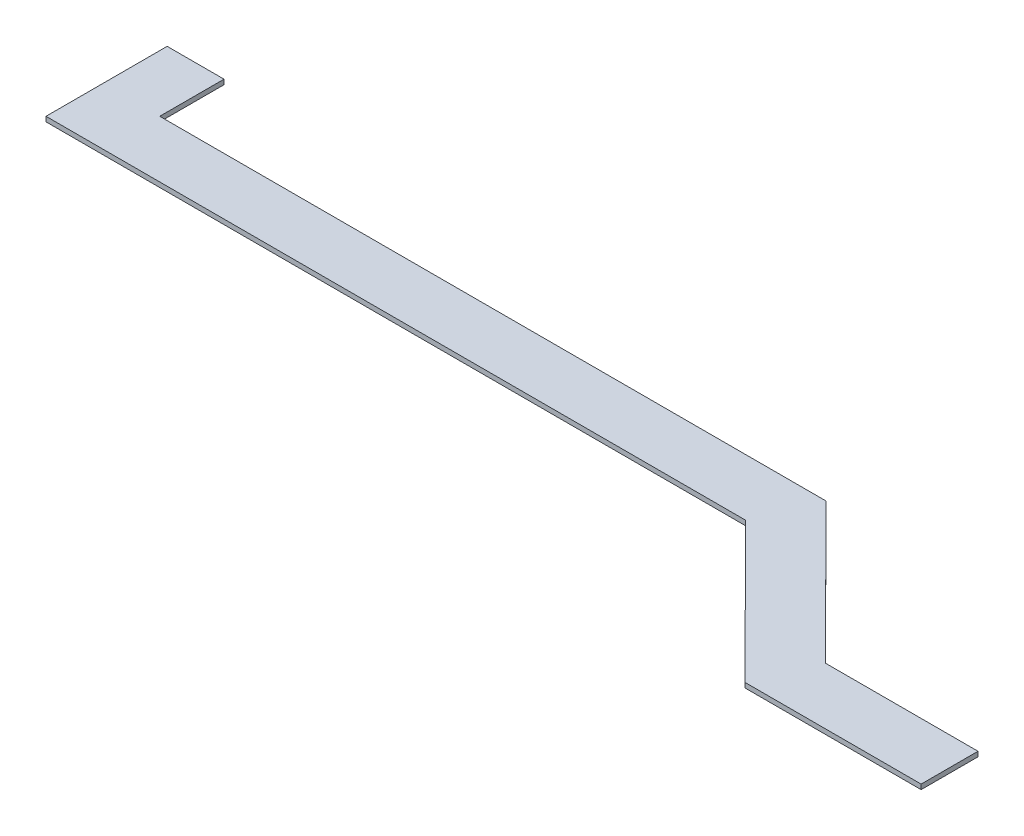
ISO-10303-21;
HEADER;
FILE_DESCRIPTION(('STEP AP214'),'2;1');
FILE_NAME('part.step','',(''),(''),'','','');
FILE_SCHEMA(('AUTOMOTIVE_DESIGN { 1 0 10303 214 1 1 1 1 }'));
ENDSEC;
DATA;
#1=APPLICATION_CONTEXT('core data for automotive mechanical design processes');
#2=APPLICATION_PROTOCOL_DEFINITION('international standard','automotive_design',2000,#1);
#3=PRODUCT_CONTEXT('',#1,'mechanical');
#4=PRODUCT('Part','Part','',(#3));
#5=PRODUCT_RELATED_PRODUCT_CATEGORY('part','',(#4));
#6=PRODUCT_DEFINITION_FORMATION('','',#4);
#7=PRODUCT_DEFINITION_CONTEXT('part definition',#1,'design');
#8=PRODUCT_DEFINITION('design','',#6,#7);
#9=PRODUCT_DEFINITION_SHAPE('','',#8);
#10=(LENGTH_UNIT() NAMED_UNIT(*) SI_UNIT(.MILLI.,.METRE.));
#11=(NAMED_UNIT(*) PLANE_ANGLE_UNIT() SI_UNIT($,.RADIAN.));
#12=(NAMED_UNIT(*) SI_UNIT($,.STERADIAN.) SOLID_ANGLE_UNIT());
#13=UNCERTAINTY_MEASURE_WITH_UNIT(LENGTH_MEASURE(1.E-05),#10,'distance_accuracy_value','');
#14=(GEOMETRIC_REPRESENTATION_CONTEXT(3) GLOBAL_UNCERTAINTY_ASSIGNED_CONTEXT((#13)) GLOBAL_UNIT_ASSIGNED_CONTEXT((#10,
#11,#12)) REPRESENTATION_CONTEXT('',''));
#15=CARTESIAN_POINT('',(0.,0.,0.));
#16=DIRECTION('',(0.,0.,1.));
#17=DIRECTION('',(1.,0.,0.));
#18=AXIS2_PLACEMENT_3D('',#15,#16,#17);
#19=CARTESIAN_POINT('',(0.,0.3,0.));
#20=DIRECTION('',(0.,0.,1.));
#21=DIRECTION('',(1.,0.,0.));
#22=AXIS2_PLACEMENT_3D('',#19,#20,#21);
#23=PLANE('',#22);
#24=DIRECTION('',(-1.,0.,0.));
#25=VECTOR('',#24,1.);
#26=CARTESIAN_POINT('',(0.,0.,0.));
#27=LINE('',#26,#25);
#28=CARTESIAN_POINT('',(3.52,0.,0.));
#29=VERTEX_POINT('',#28);
#30=CARTESIAN_POINT('',(0.,0.,0.));
#31=VERTEX_POINT('',#30);
#32=EDGE_CURVE('E145',#29,#31,#27,.T.);
#33=ORIENTED_EDGE('',*,*,#32,.T.);
#34=DIRECTION('',(0.,-1.,0.));
#35=VECTOR('',#34,1.);
#36=CARTESIAN_POINT('',(0.,0.3,0.));
#37=LINE('',#36,#35);
#38=CARTESIAN_POINT('',(0.,0.3,0.));
#39=VERTEX_POINT('',#38);
#40=EDGE_CURVE('E11',#39,#31,#37,.T.);
#41=ORIENTED_EDGE('',*,*,#40,.F.);
#42=DIRECTION('',(-1.,0.,0.));
#43=VECTOR('',#42,1.);
#44=CARTESIAN_POINT('',(0.,0.3,0.));
#45=LINE('',#44,#43);
#46=CARTESIAN_POINT('',(3.52,0.3,0.));
#47=VERTEX_POINT('',#46);
#48=EDGE_CURVE('E163',#47,#39,#45,.T.);
#49=ORIENTED_EDGE('',*,*,#48,.F.);
#50=DIRECTION('',(0.,-1.,0.));
#51=VECTOR('',#50,1.);
#52=CARTESIAN_POINT('',(3.52,0.3,0.));
#53=LINE('',#52,#51);
#54=EDGE_CURVE('E141',#47,#29,#53,.T.);
#55=ORIENTED_EDGE('',*,*,#54,.T.);
#56=EDGE_LOOP('',(#33,#41,#49,#55));
#57=FACE_BOUND('',#56,.T.);
#58=ADVANCED_FACE('F37',(#57),#23,.F.);
#59=CARTESIAN_POINT('',(0.,0.3,0.));
#60=DIRECTION('',(1.,0.,0.));
#61=DIRECTION('',(0.,0.,-1.));
#62=AXIS2_PLACEMENT_3D('',#59,#60,#61);
#63=PLANE('',#62);
#64=DIRECTION('',(0.,0.,1.));
#65=VECTOR('',#64,1.);
#66=CARTESIAN_POINT('',(0.,0.,0.));
#67=LINE('',#66,#65);
#68=CARTESIAN_POINT('',(0.,0.,7.5));
#69=VERTEX_POINT('',#68);
#70=EDGE_CURVE('E148',#31,#69,#67,.T.);
#71=ORIENTED_EDGE('',*,*,#70,.T.);
#72=DIRECTION('',(0.,-1.,0.));
#73=VECTOR('',#72,1.);
#74=CARTESIAN_POINT('',(0.,0.3,7.5));
#75=LINE('',#74,#73);
#76=CARTESIAN_POINT('',(0.,0.3,7.5));
#77=VERTEX_POINT('',#76);
#78=EDGE_CURVE('E45',#77,#69,#75,.T.);
#79=ORIENTED_EDGE('',*,*,#78,.F.);
#80=DIRECTION('',(0.,0.,1.));
#81=VECTOR('',#80,1.);
#82=CARTESIAN_POINT('',(0.,0.3,0.));
#83=LINE('',#82,#81);
#84=EDGE_CURVE('E102',#39,#77,#83,.T.);
#85=ORIENTED_EDGE('',*,*,#84,.F.);
#86=ORIENTED_EDGE('',*,*,#40,.T.);
#87=EDGE_LOOP('',(#71,#79,#85,#86));
#88=FACE_BOUND('',#87,.T.);
#89=ADVANCED_FACE('F212',(#88),#63,.F.);
#90=CARTESIAN_POINT('',(0.,0.3,7.5));
#91=DIRECTION('',(0.,0.,-1.));
#92=DIRECTION('',(-1.,0.,0.));
#93=AXIS2_PLACEMENT_3D('',#90,#91,#92);
#94=PLANE('',#93);
#95=DIRECTION('',(1.,0.,0.));
#96=VECTOR('',#95,1.);
#97=CARTESIAN_POINT('',(0.,0.,7.5));
#98=LINE('',#97,#96);
#99=CARTESIAN_POINT('',(43.3004,0.,7.5));
#100=VERTEX_POINT('',#99);
#101=EDGE_CURVE('E150',#69,#100,#98,.T.);
#102=ORIENTED_EDGE('',*,*,#101,.T.);
#103=DIRECTION('',(0.,-1.,0.));
#104=VECTOR('',#103,1.);
#105=CARTESIAN_POINT('',(43.3004,0.3,7.5));
#106=LINE('',#105,#104);
#107=CARTESIAN_POINT('',(43.3004,0.3,7.5));
#108=VERTEX_POINT('',#107);
#109=EDGE_CURVE('E176',#108,#100,#106,.T.);
#110=ORIENTED_EDGE('',*,*,#109,.F.);
#111=DIRECTION('',(1.,0.,0.));
#112=VECTOR('',#111,1.);
#113=CARTESIAN_POINT('',(0.,0.3,7.5));
#114=LINE('',#113,#112);
#115=EDGE_CURVE('E184',#77,#108,#114,.T.);
#116=ORIENTED_EDGE('',*,*,#115,.F.);
#117=ORIENTED_EDGE('',*,*,#78,.T.);
#118=EDGE_LOOP('',(#102,#110,#116,#117));
#119=FACE_BOUND('',#118,.T.);
#120=ADVANCED_FACE('F182',(#119),#94,.F.);
#121=CARTESIAN_POINT('',(43.3004,0.3,7.5));
#122=DIRECTION('',(0.708212821190194,0.,-0.705999008428359));
#123=DIRECTION('',(-0.705999008428359,0.,-0.708212821190194));
#124=AXIS2_PLACEMENT_3D('',#121,#122,#123);
#125=PLANE('',#124);
#126=DIRECTION('',(0.705999008428359,0.,0.708212821190194));
#127=VECTOR('',#126,1.);
#128=CARTESIAN_POINT('',(43.3004,0.,7.5));
#129=LINE('',#128,#127);
#130=CARTESIAN_POINT('',(51.9868,0.,16.2136380880778));
#131=VERTEX_POINT('',#130);
#132=EDGE_CURVE('E152',#100,#131,#129,.T.);
#133=ORIENTED_EDGE('',*,*,#132,.T.);
#134=DIRECTION('',(0.,-1.,0.));
#135=VECTOR('',#134,1.);
#136=CARTESIAN_POINT('',(51.9868,0.3,16.2136380880778));
#137=LINE('',#136,#135);
#138=CARTESIAN_POINT('',(51.9868,0.3,16.2136380880778));
#139=VERTEX_POINT('',#138);
#140=EDGE_CURVE('E173',#139,#131,#137,.T.);
#141=ORIENTED_EDGE('',*,*,#140,.F.);
#142=DIRECTION('',(0.705999008428359,0.,0.708212821190194));
#143=VECTOR('',#142,1.);
#144=CARTESIAN_POINT('',(43.3004,0.3,7.5));
#145=LINE('',#144,#143);
#146=EDGE_CURVE('E202',#108,#139,#145,.T.);
#147=ORIENTED_EDGE('',*,*,#146,.F.);
#148=ORIENTED_EDGE('',*,*,#109,.T.);
#149=EDGE_LOOP('',(#133,#141,#147,#148));
#150=FACE_BOUND('',#149,.T.);
#151=ADVANCED_FACE('F193',(#150),#125,.F.);
#152=CARTESIAN_POINT('',(51.9868,0.3,16.2136380880778));
#153=DIRECTION('',(0.,0.,-1.));
#154=DIRECTION('',(-1.,0.,0.));
#155=AXIS2_PLACEMENT_3D('',#152,#153,#154);
#156=PLANE('',#155);
#157=DIRECTION('',(1.,0.,0.));
#158=VECTOR('',#157,1.);
#159=CARTESIAN_POINT('',(51.9868,0.,16.2136380880778));
#160=LINE('',#159,#158);
#161=CARTESIAN_POINT('',(62.8868,0.,16.2136380880778));
#162=VERTEX_POINT('',#161);
#163=EDGE_CURVE('E154',#131,#162,#160,.T.);
#164=ORIENTED_EDGE('',*,*,#163,.T.);
#165=DIRECTION('',(0.,-1.,0.));
#166=VECTOR('',#165,1.);
#167=CARTESIAN_POINT('',(62.8868,0.3,16.2136380880778));
#168=LINE('',#167,#166);
#169=CARTESIAN_POINT('',(62.8868,0.3,16.2136380880778));
#170=VERTEX_POINT('',#169);
#171=EDGE_CURVE('E170',#170,#162,#168,.T.);
#172=ORIENTED_EDGE('',*,*,#171,.F.);
#173=DIRECTION('',(1.,0.,0.));
#174=VECTOR('',#173,1.);
#175=CARTESIAN_POINT('',(51.9868,0.3,16.2136380880778));
#176=LINE('',#175,#174);
#177=EDGE_CURVE('E199',#139,#170,#176,.T.);
#178=ORIENTED_EDGE('',*,*,#177,.F.);
#179=ORIENTED_EDGE('',*,*,#140,.T.);
#180=EDGE_LOOP('',(#164,#172,#178,#179));
#181=FACE_BOUND('',#180,.T.);
#182=ADVANCED_FACE('F197',(#181),#156,.F.);
#183=CARTESIAN_POINT('',(62.8868000000001,0.3,12.6936380880778));
#184=DIRECTION('',(-1.,0.,0.));
#185=DIRECTION('',(0.,0.,1.));
#186=AXIS2_PLACEMENT_3D('',#183,#184,#185);
#187=PLANE('',#186);
#188=DIRECTION('',(0.,0.,-1.));
#189=VECTOR('',#188,1.);
#190=CARTESIAN_POINT('',(62.8868000000001,0.,12.6936380880778));
#191=LINE('',#190,#189);
#192=CARTESIAN_POINT('',(62.8868000000001,0.,12.6936380880778));
#193=VERTEX_POINT('',#192);
#194=EDGE_CURVE('E156',#162,#193,#191,.T.);
#195=ORIENTED_EDGE('',*,*,#194,.T.);
#196=DIRECTION('',(0.,-1.,0.));
#197=VECTOR('',#196,1.);
#198=CARTESIAN_POINT('',(62.8868000000001,0.3,12.6936380880778));
#199=LINE('',#198,#197);
#200=CARTESIAN_POINT('',(62.8868000000001,0.3,12.6936380880778));
#201=VERTEX_POINT('',#200);
#202=EDGE_CURVE('E167',#201,#193,#199,.T.);
#203=ORIENTED_EDGE('',*,*,#202,.F.);
#204=DIRECTION('',(0.,0.,-1.));
#205=VECTOR('',#204,1.);
#206=CARTESIAN_POINT('',(62.8868000000001,0.3,12.6936380880778));
#207=LINE('',#206,#205);
#208=EDGE_CURVE('E201',#170,#201,#207,.T.);
#209=ORIENTED_EDGE('',*,*,#208,.F.);
#210=ORIENTED_EDGE('',*,*,#171,.T.);
#211=EDGE_LOOP('',(#195,#203,#209,#210));
#212=FACE_BOUND('',#211,.T.);
#213=ADVANCED_FACE('F224',(#212),#187,.F.);
#214=CARTESIAN_POINT('',(53.4480605976167,0.3,12.6936380880778));
#215=DIRECTION('',(0.,0.,1.));
#216=DIRECTION('',(1.,0.,0.));
#217=AXIS2_PLACEMENT_3D('',#214,#215,#216);
#218=PLANE('',#217);
#219=DIRECTION('',(-1.,0.,0.));
#220=VECTOR('',#219,1.);
#221=CARTESIAN_POINT('',(53.4480605976167,0.,12.6936380880778));
#222=LINE('',#221,#220);
#223=CARTESIAN_POINT('',(53.4480605976167,0.,12.6936380880778));
#224=VERTEX_POINT('',#223);
#225=EDGE_CURVE('E158',#193,#224,#222,.T.);
#226=ORIENTED_EDGE('',*,*,#225,.T.);
#227=DIRECTION('',(0.,-1.,0.));
#228=VECTOR('',#227,1.);
#229=CARTESIAN_POINT('',(53.4480605976167,0.3,12.6936380880778));
#230=LINE('',#229,#228);
#231=CARTESIAN_POINT('',(53.4480605976167,0.3,12.6936380880778));
#232=VERTEX_POINT('',#231);
#233=EDGE_CURVE('E136',#232,#224,#230,.T.);
#234=ORIENTED_EDGE('',*,*,#233,.F.);
#235=DIRECTION('',(-1.,0.,0.));
#236=VECTOR('',#235,1.);
#237=CARTESIAN_POINT('',(53.4480605976167,0.3,12.6936380880778));
#238=LINE('',#237,#236);
#239=EDGE_CURVE('E127',#201,#232,#238,.T.);
#240=ORIENTED_EDGE('',*,*,#239,.F.);
#241=ORIENTED_EDGE('',*,*,#202,.T.);
#242=EDGE_LOOP('',(#226,#234,#240,#241));
#243=FACE_BOUND('',#242,.T.);
#244=ADVANCED_FACE('F227',(#243),#218,.F.);
#245=CARTESIAN_POINT('',(44.7616605976167,0.3,3.98));
#246=DIRECTION('',(-0.708212821190194,0.,0.705999008428359));
#247=DIRECTION('',(0.705999008428359,0.,0.708212821190194));
#248=AXIS2_PLACEMENT_3D('',#245,#246,#247);
#249=PLANE('',#248);
#250=DIRECTION('',(-0.705999008428359,0.,-0.708212821190194));
#251=VECTOR('',#250,1.);
#252=CARTESIAN_POINT('',(44.7616605976167,0.,3.98));
#253=LINE('',#252,#251);
#254=CARTESIAN_POINT('',(44.7616605976167,0.,3.98));
#255=VERTEX_POINT('',#254);
#256=EDGE_CURVE('E135',#224,#255,#253,.T.);
#257=ORIENTED_EDGE('',*,*,#256,.T.);
#258=DIRECTION('',(0.,-1.,0.));
#259=VECTOR('',#258,1.);
#260=CARTESIAN_POINT('',(44.7616605976167,0.3,3.98));
#261=LINE('',#260,#259);
#262=CARTESIAN_POINT('',(44.7616605976167,0.3,3.98));
#263=VERTEX_POINT('',#262);
#264=EDGE_CURVE('E132',#263,#255,#261,.T.);
#265=ORIENTED_EDGE('',*,*,#264,.F.);
#266=DIRECTION('',(-0.705999008428359,0.,-0.708212821190194));
#267=VECTOR('',#266,1.);
#268=CARTESIAN_POINT('',(44.7616605976167,0.3,3.98));
#269=LINE('',#268,#267);
#270=EDGE_CURVE('E121',#232,#263,#269,.T.);
#271=ORIENTED_EDGE('',*,*,#270,.F.);
#272=ORIENTED_EDGE('',*,*,#233,.T.);
#273=EDGE_LOOP('',(#257,#265,#271,#272));
#274=FACE_BOUND('',#273,.T.);
#275=ADVANCED_FACE('F133',(#274),#249,.F.);
#276=CARTESIAN_POINT('',(3.52,0.3,3.98));
#277=DIRECTION('',(0.,0.,1.));
#278=DIRECTION('',(1.,0.,0.));
#279=AXIS2_PLACEMENT_3D('',#276,#277,#278);
#280=PLANE('',#279);
#281=DIRECTION('',(-1.,0.,0.));
#282=VECTOR('',#281,1.);
#283=CARTESIAN_POINT('',(3.52,0.,3.98));
#284=LINE('',#283,#282);
#285=CARTESIAN_POINT('',(3.52,0.,3.98));
#286=VERTEX_POINT('',#285);
#287=EDGE_CURVE('E88',#255,#286,#284,.T.);
#288=ORIENTED_EDGE('',*,*,#287,.T.);
#289=DIRECTION('',(0.,-1.,0.));
#290=VECTOR('',#289,1.);
#291=CARTESIAN_POINT('',(3.52,0.3,3.98));
#292=LINE('',#291,#290);
#293=CARTESIAN_POINT('',(3.52,0.3,3.98));
#294=VERTEX_POINT('',#293);
#295=EDGE_CURVE('E137',#294,#286,#292,.T.);
#296=ORIENTED_EDGE('',*,*,#295,.F.);
#297=DIRECTION('',(-1.,0.,0.));
#298=VECTOR('',#297,1.);
#299=CARTESIAN_POINT('',(3.52,0.3,3.98));
#300=LINE('',#299,#298);
#301=EDGE_CURVE('E125',#263,#294,#300,.T.);
#302=ORIENTED_EDGE('',*,*,#301,.F.);
#303=ORIENTED_EDGE('',*,*,#264,.T.);
#304=EDGE_LOOP('',(#288,#296,#302,#303));
#305=FACE_BOUND('',#304,.T.);
#306=ADVANCED_FACE('F139',(#305),#280,.F.);
#307=CARTESIAN_POINT('',(3.52,0.3,0.));
#308=DIRECTION('',(-1.,0.,0.));
#309=DIRECTION('',(0.,0.,1.));
#310=AXIS2_PLACEMENT_3D('',#307,#308,#309);
#311=PLANE('',#310);
#312=DIRECTION('',(0.,0.,-1.));
#313=VECTOR('',#312,1.);
#314=CARTESIAN_POINT('',(3.52,0.,0.));
#315=LINE('',#314,#313);
#316=EDGE_CURVE('E94',#286,#29,#315,.T.);
#317=ORIENTED_EDGE('',*,*,#316,.T.);
#318=ORIENTED_EDGE('',*,*,#54,.F.);
#319=DIRECTION('',(0.,0.,-1.));
#320=VECTOR('',#319,1.);
#321=CARTESIAN_POINT('',(3.52,0.3,0.));
#322=LINE('',#321,#320);
#323=EDGE_CURVE('E53',#294,#47,#322,.T.);
#324=ORIENTED_EDGE('',*,*,#323,.F.);
#325=ORIENTED_EDGE('',*,*,#295,.T.);
#326=EDGE_LOOP('',(#317,#318,#324,#325));
#327=FACE_BOUND('',#326,.T.);
#328=ADVANCED_FACE('F236',(#327),#311,.F.);
#329=CARTESIAN_POINT('',(0.,0.3,0.));
#330=DIRECTION('',(0.,-1.,0.));
#331=DIRECTION('',(0.,0.,-1.));
#332=AXIS2_PLACEMENT_3D('',#329,#330,#331);
#333=PLANE('',#332);
#334=ORIENTED_EDGE('',*,*,#48,.T.);
#335=ORIENTED_EDGE('',*,*,#84,.T.);
#336=ORIENTED_EDGE('',*,*,#115,.T.);
#337=ORIENTED_EDGE('',*,*,#146,.T.);
#338=ORIENTED_EDGE('',*,*,#177,.T.);
#339=ORIENTED_EDGE('',*,*,#208,.T.);
#340=ORIENTED_EDGE('',*,*,#239,.T.);
#341=ORIENTED_EDGE('',*,*,#270,.T.);
#342=ORIENTED_EDGE('',*,*,#301,.T.);
#343=ORIENTED_EDGE('',*,*,#323,.T.);
#344=EDGE_LOOP('',(#334,#335,#336,#337,#338,#339,#340,#341,#342,#343));
#345=FACE_BOUND('',#344,.T.);
#346=ADVANCED_FACE('F123',(#345),#333,.F.);
#347=CARTESIAN_POINT('',(0.,0.,0.));
#348=DIRECTION('',(0.,-1.,0.));
#349=DIRECTION('',(0.,0.,-1.));
#350=AXIS2_PLACEMENT_3D('',#347,#348,#349);
#351=PLANE('',#350);
#352=ORIENTED_EDGE('',*,*,#32,.F.);
#353=ORIENTED_EDGE('',*,*,#316,.F.);
#354=ORIENTED_EDGE('',*,*,#287,.F.);
#355=ORIENTED_EDGE('',*,*,#256,.F.);
#356=ORIENTED_EDGE('',*,*,#225,.F.);
#357=ORIENTED_EDGE('',*,*,#194,.F.);
#358=ORIENTED_EDGE('',*,*,#163,.F.);
#359=ORIENTED_EDGE('',*,*,#132,.F.);
#360=ORIENTED_EDGE('',*,*,#101,.F.);
#361=ORIENTED_EDGE('',*,*,#70,.F.);
#362=EDGE_LOOP('',(#352,#353,#354,#355,#356,#357,#358,#359,#360,#361));
#363=FACE_BOUND('',#362,.T.);
#364=ADVANCED_FACE('F188',(#363),#351,.T.);
#365=CLOSED_SHELL('',(#58,#89,#120,#151,#182,#213,#244,#275,#306,#328,#346,#364));
#366=MANIFOLD_SOLID_BREP('B2',#365);
#367=ADVANCED_BREP_SHAPE_REPRESENTATION('',(#18,#366),#14);
#368=SHAPE_DEFINITION_REPRESENTATION(#9,#367);
ENDSEC;
END-ISO-10303-21;
